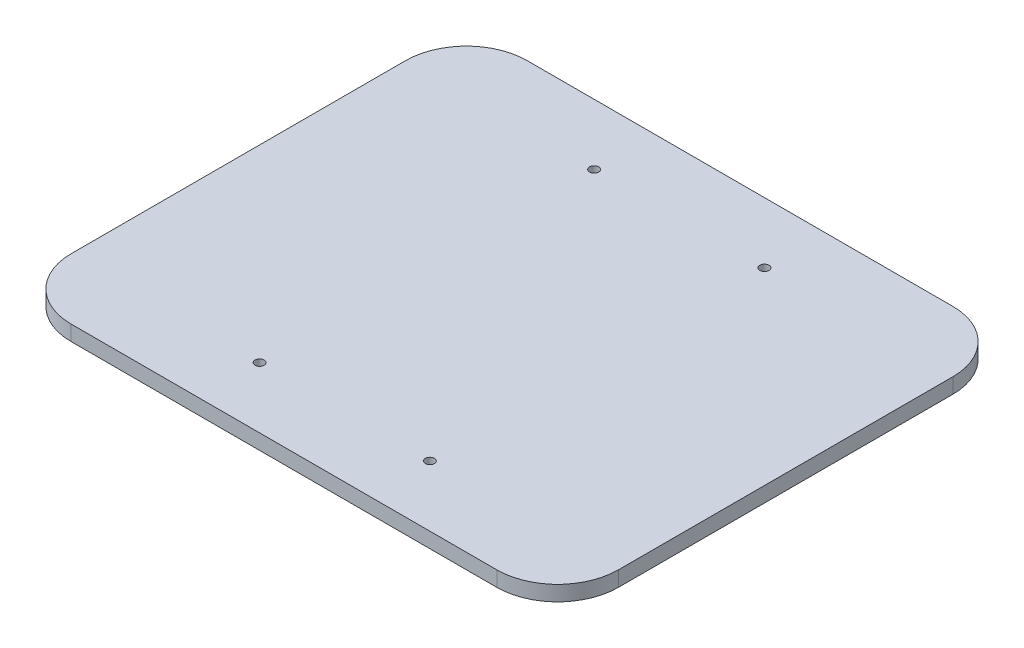
ISO-10303-21;
HEADER;
FILE_DESCRIPTION(('STEP AP214'),'2;1');
FILE_NAME('part.step','',(''),(''),'','','');
FILE_SCHEMA(('AUTOMOTIVE_DESIGN { 1 0 10303 214 1 1 1 1 }'));
ENDSEC;
DATA;
#1=APPLICATION_CONTEXT('core data for automotive mechanical design processes');
#2=APPLICATION_PROTOCOL_DEFINITION('international standard','automotive_design',2000,#1);
#3=PRODUCT_CONTEXT('',#1,'mechanical');
#4=PRODUCT('Part','Part','',(#3));
#5=PRODUCT_RELATED_PRODUCT_CATEGORY('part','',(#4));
#6=PRODUCT_DEFINITION_FORMATION('','',#4);
#7=PRODUCT_DEFINITION_CONTEXT('part definition',#1,'design');
#8=PRODUCT_DEFINITION('design','',#6,#7);
#9=PRODUCT_DEFINITION_SHAPE('','',#8);
#10=(LENGTH_UNIT() NAMED_UNIT(*) SI_UNIT(.MILLI.,.METRE.));
#11=(NAMED_UNIT(*) PLANE_ANGLE_UNIT() SI_UNIT($,.RADIAN.));
#12=(NAMED_UNIT(*) SI_UNIT($,.STERADIAN.) SOLID_ANGLE_UNIT());
#13=UNCERTAINTY_MEASURE_WITH_UNIT(LENGTH_MEASURE(1.E-05),#10,'distance_accuracy_value','');
#14=(GEOMETRIC_REPRESENTATION_CONTEXT(3) GLOBAL_UNCERTAINTY_ASSIGNED_CONTEXT((#13)) GLOBAL_UNIT_ASSIGNED_CONTEXT((#10,
#11,#12)) REPRESENTATION_CONTEXT('',''));
#15=CARTESIAN_POINT('',(0.,0.,0.));
#16=DIRECTION('',(0.,0.,1.));
#17=DIRECTION('',(1.,0.,0.));
#18=AXIS2_PLACEMENT_3D('',#15,#16,#17);
#19=CARTESIAN_POINT('',(99.18397760156,5.,-163.114483400198));
#20=DIRECTION('',(0.,-1.,0.));
#21=DIRECTION('',(0.,0.,-1.));
#22=AXIS2_PLACEMENT_3D('',#19,#20,#21);
#23=CYLINDRICAL_SURFACE('',#22,20.);
#24=CARTESIAN_POINT('',(99.18397760156,0.,-163.114483400198));
#25=DIRECTION('',(0.,1.,0.));
#26=DIRECTION('',(0.,0.,-1.));
#27=AXIS2_PLACEMENT_3D('',#24,#25,#26);
#28=CIRCLE('',#27,20.);
#29=CARTESIAN_POINT('',(119.18397760156,0.,-163.114483400198));
#30=VERTEX_POINT('',#29);
#31=CARTESIAN_POINT('',(99.18397760156,0.,-183.114483400198));
#32=VERTEX_POINT('',#31);
#33=EDGE_CURVE('E131',#30,#32,#28,.T.);
#34=ORIENTED_EDGE('',*,*,#33,.T.);
#35=DIRECTION('',(0.,-1.,0.));
#36=VECTOR('',#35,1.);
#37=CARTESIAN_POINT('',(99.18397760156,5.,-183.114483400198));
#38=LINE('',#37,#36);
#39=CARTESIAN_POINT('',(99.18397760156,5.,-183.114483400198));
#40=VERTEX_POINT('',#39);
#41=EDGE_CURVE('E11',#40,#32,#38,.T.);
#42=ORIENTED_EDGE('',*,*,#41,.F.);
#43=CARTESIAN_POINT('',(99.18397760156,5.,-163.114483400198));
#44=DIRECTION('',(0.,1.,0.));
#45=DIRECTION('',(0.,0.,-1.));
#46=AXIS2_PLACEMENT_3D('',#43,#44,#45);
#47=CIRCLE('',#46,20.);
#48=CARTESIAN_POINT('',(119.18397760156,5.,-163.114483400198));
#49=VERTEX_POINT('',#48);
#50=EDGE_CURVE('E146',#49,#40,#47,.T.);
#51=ORIENTED_EDGE('',*,*,#50,.F.);
#52=DIRECTION('',(0.,-1.,0.));
#53=VECTOR('',#52,1.);
#54=CARTESIAN_POINT('',(119.18397760156,5.,-163.114483400198));
#55=LINE('',#54,#53);
#56=EDGE_CURVE('E127',#49,#30,#55,.T.);
#57=ORIENTED_EDGE('',*,*,#56,.T.);
#58=EDGE_LOOP('',(#34,#42,#51,#57));
#59=FACE_BOUND('',#58,.T.);
#60=ADVANCED_FACE('F33',(#59),#23,.T.);
#61=CARTESIAN_POINT('',(-40.81602239844,5.,-183.114483400198));
#62=DIRECTION('',(0.,0.,1.));
#63=DIRECTION('',(1.,0.,0.));
#64=AXIS2_PLACEMENT_3D('',#61,#62,#63);
#65=PLANE('',#64);
#66=DIRECTION('',(-1.,0.,0.));
#67=VECTOR('',#66,1.);
#68=CARTESIAN_POINT('',(-40.81602239844,0.,-183.114483400198));
#69=LINE('',#68,#67);
#70=CARTESIAN_POINT('',(-40.81602239844,0.,-183.114483400198));
#71=VERTEX_POINT('',#70);
#72=EDGE_CURVE('E134',#32,#71,#69,.T.);
#73=ORIENTED_EDGE('',*,*,#72,.T.);
#74=DIRECTION('',(0.,-1.,0.));
#75=VECTOR('',#74,1.);
#76=CARTESIAN_POINT('',(-40.81602239844,5.,-183.114483400198));
#77=LINE('',#76,#75);
#78=CARTESIAN_POINT('',(-40.81602239844,5.,-183.114483400198));
#79=VERTEX_POINT('',#78);
#80=EDGE_CURVE('E42',#79,#71,#77,.T.);
#81=ORIENTED_EDGE('',*,*,#80,.F.);
#82=DIRECTION('',(-1.,0.,0.));
#83=VECTOR('',#82,1.);
#84=CARTESIAN_POINT('',(-40.81602239844,5.,-183.114483400198));
#85=LINE('',#84,#83);
#86=EDGE_CURVE('E94',#40,#79,#85,.T.);
#87=ORIENTED_EDGE('',*,*,#86,.F.);
#88=ORIENTED_EDGE('',*,*,#41,.T.);
#89=EDGE_LOOP('',(#73,#81,#87,#88));
#90=FACE_BOUND('',#89,.T.);
#91=ADVANCED_FACE('F213',(#90),#65,.F.);
#92=CARTESIAN_POINT('',(-40.81602239844,5.,-163.114483400198));
#93=DIRECTION('',(0.,-1.,0.));
#94=DIRECTION('',(0.,0.,-1.));
#95=AXIS2_PLACEMENT_3D('',#92,#93,#94);
#96=CYLINDRICAL_SURFACE('',#95,20.);
#97=CARTESIAN_POINT('',(-40.81602239844,0.,-163.114483400198));
#98=DIRECTION('',(0.,1.,0.));
#99=DIRECTION('',(0.,0.,1.));
#100=AXIS2_PLACEMENT_3D('',#97,#98,#99);
#101=CIRCLE('',#100,20.);
#102=CARTESIAN_POINT('',(-60.81602239844,0.,-163.114483400198));
#103=VERTEX_POINT('',#102);
#104=EDGE_CURVE('E137',#71,#103,#101,.T.);
#105=ORIENTED_EDGE('',*,*,#104,.T.);
#106=DIRECTION('',(0.,-1.,0.));
#107=VECTOR('',#106,1.);
#108=CARTESIAN_POINT('',(-60.81602239844,5.,-163.114483400198));
#109=LINE('',#108,#107);
#110=CARTESIAN_POINT('',(-60.81602239844,5.,-163.114483400198));
#111=VERTEX_POINT('',#110);
#112=EDGE_CURVE('E153',#111,#103,#109,.T.);
#113=ORIENTED_EDGE('',*,*,#112,.F.);
#114=CARTESIAN_POINT('',(-40.81602239844,5.,-163.114483400198));
#115=DIRECTION('',(0.,1.,0.));
#116=DIRECTION('',(0.,0.,1.));
#117=AXIS2_PLACEMENT_3D('',#114,#115,#116);
#118=CIRCLE('',#117,20.);
#119=EDGE_CURVE('E181',#79,#111,#118,.T.);
#120=ORIENTED_EDGE('',*,*,#119,.F.);
#121=ORIENTED_EDGE('',*,*,#80,.T.);
#122=EDGE_LOOP('',(#105,#113,#120,#121));
#123=FACE_BOUND('',#122,.T.);
#124=ADVANCED_FACE('F217',(#123),#96,.T.);
#125=CARTESIAN_POINT('',(-60.81602239844,5.,-163.114483400198));
#126=DIRECTION('',(1.,0.,0.));
#127=DIRECTION('',(0.,0.,-1.));
#128=AXIS2_PLACEMENT_3D('',#125,#126,#127);
#129=PLANE('',#128);
#130=DIRECTION('',(0.,0.,1.));
#131=VECTOR('',#130,1.);
#132=CARTESIAN_POINT('',(-60.81602239844,0.,-163.114483400198));
#133=LINE('',#132,#131);
#134=CARTESIAN_POINT('',(-60.81602239844,0.,-53.1144834001978));
#135=VERTEX_POINT('',#134);
#136=EDGE_CURVE('E139',#103,#135,#133,.T.);
#137=ORIENTED_EDGE('',*,*,#136,.T.);
#138=DIRECTION('',(0.,-1.,0.));
#139=VECTOR('',#138,1.);
#140=CARTESIAN_POINT('',(-60.81602239844,5.,-53.1144834001978));
#141=LINE('',#140,#139);
#142=CARTESIAN_POINT('',(-60.81602239844,5.,-53.1144834001978));
#143=VERTEX_POINT('',#142);
#144=EDGE_CURVE('E150',#143,#135,#141,.T.);
#145=ORIENTED_EDGE('',*,*,#144,.F.);
#146=DIRECTION('',(0.,0.,1.));
#147=VECTOR('',#146,1.);
#148=CARTESIAN_POINT('',(-60.81602239844,5.,-163.114483400198));
#149=LINE('',#148,#147);
#150=EDGE_CURVE('E183',#111,#143,#149,.T.);
#151=ORIENTED_EDGE('',*,*,#150,.F.);
#152=ORIENTED_EDGE('',*,*,#112,.T.);
#153=EDGE_LOOP('',(#137,#145,#151,#152));
#154=FACE_BOUND('',#153,.T.);
#155=ADVANCED_FACE('F189',(#154),#129,.F.);
#156=CARTESIAN_POINT('',(-40.81602239844,5.,-53.1144834001977));
#157=DIRECTION('',(0.,-1.,0.));
#158=DIRECTION('',(0.,0.,-1.));
#159=AXIS2_PLACEMENT_3D('',#156,#157,#158);
#160=CYLINDRICAL_SURFACE('',#159,20.);
#161=CARTESIAN_POINT('',(-40.81602239844,0.,-53.1144834001977));
#162=DIRECTION('',(0.,1.,0.));
#163=DIRECTION('',(0.,0.,1.));
#164=AXIS2_PLACEMENT_3D('',#161,#162,#163);
#165=CIRCLE('',#164,20.);
#166=CARTESIAN_POINT('',(-40.81602239844,0.,-33.1144834001977));
#167=VERTEX_POINT('',#166);
#168=EDGE_CURVE('E141',#135,#167,#165,.T.);
#169=ORIENTED_EDGE('',*,*,#168,.T.);
#170=DIRECTION('',(0.,-1.,0.));
#171=VECTOR('',#170,1.);
#172=CARTESIAN_POINT('',(-40.81602239844,5.,-33.1144834001977));
#173=LINE('',#172,#171);
#174=CARTESIAN_POINT('',(-40.81602239844,5.,-33.1144834001977));
#175=VERTEX_POINT('',#174);
#176=EDGE_CURVE('E122',#175,#167,#173,.T.);
#177=ORIENTED_EDGE('',*,*,#176,.F.);
#178=CARTESIAN_POINT('',(-40.81602239844,5.,-53.1144834001977));
#179=DIRECTION('',(0.,1.,0.));
#180=DIRECTION('',(0.,0.,1.));
#181=AXIS2_PLACEMENT_3D('',#178,#179,#180);
#182=CIRCLE('',#181,20.);
#183=EDGE_CURVE('E113',#143,#175,#182,.T.);
#184=ORIENTED_EDGE('',*,*,#183,.F.);
#185=ORIENTED_EDGE('',*,*,#144,.T.);
#186=EDGE_LOOP('',(#169,#177,#184,#185));
#187=FACE_BOUND('',#186,.T.);
#188=ADVANCED_FACE('F193',(#187),#160,.T.);
#189=CARTESIAN_POINT('',(-40.8160223984398,5.,-33.1144834001977));
#190=DIRECTION('',(0.,0.,-1.));
#191=DIRECTION('',(-1.,0.,0.));
#192=AXIS2_PLACEMENT_3D('',#189,#190,#191);
#193=PLANE('',#192);
#194=DIRECTION('',(1.,0.,0.));
#195=VECTOR('',#194,1.);
#196=CARTESIAN_POINT('',(-40.8160223984398,0.,-33.1144834001977));
#197=LINE('',#196,#195);
#198=CARTESIAN_POINT('',(99.18397760156,0.,-33.1144834001977));
#199=VERTEX_POINT('',#198);
#200=EDGE_CURVE('E121',#167,#199,#197,.T.);
#201=ORIENTED_EDGE('',*,*,#200,.T.);
#202=DIRECTION('',(0.,-1.,0.));
#203=VECTOR('',#202,1.);
#204=CARTESIAN_POINT('',(99.18397760156,5.,-33.1144834001977));
#205=LINE('',#204,#203);
#206=CARTESIAN_POINT('',(99.18397760156,5.,-33.1144834001977));
#207=VERTEX_POINT('',#206);
#208=EDGE_CURVE('E118',#207,#199,#205,.T.);
#209=ORIENTED_EDGE('',*,*,#208,.F.);
#210=DIRECTION('',(1.,0.,0.));
#211=VECTOR('',#210,1.);
#212=CARTESIAN_POINT('',(-40.8160223984398,5.,-33.1144834001977));
#213=LINE('',#212,#211);
#214=EDGE_CURVE('E107',#175,#207,#213,.T.);
#215=ORIENTED_EDGE('',*,*,#214,.F.);
#216=ORIENTED_EDGE('',*,*,#176,.T.);
#217=EDGE_LOOP('',(#201,#209,#215,#216));
#218=FACE_BOUND('',#217,.T.);
#219=ADVANCED_FACE('F119',(#218),#193,.F.);
#220=CARTESIAN_POINT('',(99.18397760156,5.,-53.1144834001977));
#221=DIRECTION('',(0.,-1.,0.));
#222=DIRECTION('',(0.,0.,-1.));
#223=AXIS2_PLACEMENT_3D('',#220,#221,#222);
#224=CYLINDRICAL_SURFACE('',#223,20.);
#225=CARTESIAN_POINT('',(99.18397760156,0.,-53.1144834001977));
#226=DIRECTION('',(0.,1.,0.));
#227=DIRECTION('',(0.,0.,1.));
#228=AXIS2_PLACEMENT_3D('',#225,#226,#227);
#229=CIRCLE('',#228,20.);
#230=CARTESIAN_POINT('',(119.18397760156,0.,-53.1144834001977));
#231=VERTEX_POINT('',#230);
#232=EDGE_CURVE('E80',#199,#231,#229,.T.);
#233=ORIENTED_EDGE('',*,*,#232,.T.);
#234=DIRECTION('',(0.,-1.,0.));
#235=VECTOR('',#234,1.);
#236=CARTESIAN_POINT('',(119.18397760156,5.,-53.1144834001977));
#237=LINE('',#236,#235);
#238=CARTESIAN_POINT('',(119.18397760156,5.,-53.1144834001977));
#239=VERTEX_POINT('',#238);
#240=EDGE_CURVE('E123',#239,#231,#237,.T.);
#241=ORIENTED_EDGE('',*,*,#240,.F.);
#242=CARTESIAN_POINT('',(99.18397760156,5.,-53.1144834001977));
#243=DIRECTION('',(0.,1.,0.));
#244=DIRECTION('',(0.,0.,1.));
#245=AXIS2_PLACEMENT_3D('',#242,#243,#244);
#246=CIRCLE('',#245,20.);
#247=EDGE_CURVE('E111',#207,#239,#246,.T.);
#248=ORIENTED_EDGE('',*,*,#247,.F.);
#249=ORIENTED_EDGE('',*,*,#208,.T.);
#250=EDGE_LOOP('',(#233,#241,#248,#249));
#251=FACE_BOUND('',#250,.T.);
#252=ADVANCED_FACE('F125',(#251),#224,.T.);
#253=CARTESIAN_POINT('',(119.18397760156,5.,-163.114483400198));
#254=DIRECTION('',(-1.,0.,0.));
#255=DIRECTION('',(0.,0.,1.));
#256=AXIS2_PLACEMENT_3D('',#253,#254,#255);
#257=PLANE('',#256);
#258=DIRECTION('',(0.,0.,-1.));
#259=VECTOR('',#258,1.);
#260=CARTESIAN_POINT('',(119.18397760156,0.,-163.114483400198));
#261=LINE('',#260,#259);
#262=EDGE_CURVE('E86',#231,#30,#261,.T.);
#263=ORIENTED_EDGE('',*,*,#262,.T.);
#264=ORIENTED_EDGE('',*,*,#56,.F.);
#265=DIRECTION('',(0.,0.,-1.));
#266=VECTOR('',#265,1.);
#267=CARTESIAN_POINT('',(119.18397760156,5.,-163.114483400198));
#268=LINE('',#267,#266);
#269=EDGE_CURVE('E51',#239,#49,#268,.T.);
#270=ORIENTED_EDGE('',*,*,#269,.F.);
#271=ORIENTED_EDGE('',*,*,#240,.T.);
#272=EDGE_LOOP('',(#263,#264,#270,#271));
#273=FACE_BOUND('',#272,.T.);
#274=ADVANCED_FACE('F201',(#273),#257,.F.);
#275=CARTESIAN_POINT('',(99.18397760156,5.,-163.114483400198));
#276=DIRECTION('',(0.,-1.,0.));
#277=DIRECTION('',(0.,0.,-1.));
#278=AXIS2_PLACEMENT_3D('',#275,#276,#277);
#279=PLANE('',#278);
#280=CARTESIAN_POINT('',(57.18397760156,5.,-163.114483400198));
#281=DIRECTION('',(0.,1.,0.));
#282=DIRECTION('',(0.,0.,1.));
#283=AXIS2_PLACEMENT_3D('',#280,#281,#282);
#284=CIRCLE('',#283,1.5);
#285=CARTESIAN_POINT('',(57.18397760156,5.,-161.614483400198));
#286=VERTEX_POINT('',#285);
#287=EDGE_CURVE('E164',#286,#286,#284,.T.);
#288=ORIENTED_EDGE('',*,*,#287,.F.);
#289=EDGE_LOOP('',(#288));
#290=FACE_BOUND('',#289,.T.);
#291=CARTESIAN_POINT('',(57.18397760156,5.,-53.1144834001977));
#292=DIRECTION('',(0.,1.,0.));
#293=DIRECTION('',(0.,0.,1.));
#294=AXIS2_PLACEMENT_3D('',#291,#292,#293);
#295=CIRCLE('',#294,1.5);
#296=CARTESIAN_POINT('',(57.18397760156,5.,-51.6144834001977));
#297=VERTEX_POINT('',#296);
#298=EDGE_CURVE('E300',#297,#297,#295,.T.);
#299=ORIENTED_EDGE('',*,*,#298,.F.);
#300=EDGE_LOOP('',(#299));
#301=FACE_BOUND('',#300,.T.);
#302=CARTESIAN_POINT('',(1.18397760156001,5.,-53.1144834001977));
#303=DIRECTION('',(0.,1.,0.));
#304=DIRECTION('',(0.,0.,1.));
#305=AXIS2_PLACEMENT_3D('',#302,#303,#304);
#306=CIRCLE('',#305,1.5);
#307=CARTESIAN_POINT('',(1.18397760156001,5.,-51.6144834001977));
#308=VERTEX_POINT('',#307);
#309=EDGE_CURVE('E177',#308,#308,#306,.T.);
#310=ORIENTED_EDGE('',*,*,#309,.F.);
#311=EDGE_LOOP('',(#310));
#312=FACE_BOUND('',#311,.T.);
#313=CARTESIAN_POINT('',(1.18397760156001,5.,-163.114483400198));
#314=DIRECTION('',(0.,1.,0.));
#315=DIRECTION('',(0.,0.,1.));
#316=AXIS2_PLACEMENT_3D('',#313,#314,#315);
#317=CIRCLE('',#316,1.5);
#318=CARTESIAN_POINT('',(1.18397760156001,5.,-161.614483400198));
#319=VERTEX_POINT('',#318);
#320=EDGE_CURVE('E160',#319,#319,#317,.T.);
#321=ORIENTED_EDGE('',*,*,#320,.F.);
#322=EDGE_LOOP('',(#321));
#323=FACE_BOUND('',#322,.T.);
#324=ORIENTED_EDGE('',*,*,#50,.T.);
#325=ORIENTED_EDGE('',*,*,#86,.T.);
#326=ORIENTED_EDGE('',*,*,#119,.T.);
#327=ORIENTED_EDGE('',*,*,#150,.T.);
#328=ORIENTED_EDGE('',*,*,#183,.T.);
#329=ORIENTED_EDGE('',*,*,#214,.T.);
#330=ORIENTED_EDGE('',*,*,#247,.T.);
#331=ORIENTED_EDGE('',*,*,#269,.T.);
#332=EDGE_LOOP('',(#324,#325,#326,#327,#328,#329,#330,#331));
#333=FACE_BOUND('',#332,.T.);
#334=ADVANCED_FACE('F109',(#290,#301,#312,#323,#333),#279,.F.);
#335=CARTESIAN_POINT('',(99.18397760156,0.,-163.114483400198));
#336=DIRECTION('',(0.,-1.,0.));
#337=DIRECTION('',(0.,0.,-1.));
#338=AXIS2_PLACEMENT_3D('',#335,#336,#337);
#339=PLANE('',#338);
#340=CARTESIAN_POINT('',(57.18397760156,0.,-163.114483400198));
#341=DIRECTION('',(0.,-1.,0.));
#342=DIRECTION('',(0.,0.,-1.));
#343=AXIS2_PLACEMENT_3D('',#340,#341,#342);
#344=CIRCLE('',#343,1.5);
#345=CARTESIAN_POINT('',(57.18397760156,0.,-164.614483400198));
#346=VERTEX_POINT('',#345);
#347=EDGE_CURVE('E36',#346,#346,#344,.T.);
#348=ORIENTED_EDGE('',*,*,#347,.F.);
#349=EDGE_LOOP('',(#348));
#350=FACE_BOUND('',#349,.T.);
#351=CARTESIAN_POINT('',(57.18397760156,0.,-53.1144834001977));
#352=DIRECTION('',(0.,-1.,0.));
#353=DIRECTION('',(0.,0.,-1.));
#354=AXIS2_PLACEMENT_3D('',#351,#352,#353);
#355=CIRCLE('',#354,1.5);
#356=CARTESIAN_POINT('',(57.18397760156,0.,-54.6144834001977));
#357=VERTEX_POINT('',#356);
#358=EDGE_CURVE('E163',#357,#357,#355,.T.);
#359=ORIENTED_EDGE('',*,*,#358,.F.);
#360=EDGE_LOOP('',(#359));
#361=FACE_BOUND('',#360,.T.);
#362=CARTESIAN_POINT('',(1.18397760156001,0.,-53.1144834001977));
#363=DIRECTION('',(0.,-1.,0.));
#364=DIRECTION('',(0.,0.,-1.));
#365=AXIS2_PLACEMENT_3D('',#362,#363,#364);
#366=CIRCLE('',#365,1.5);
#367=CARTESIAN_POINT('',(1.18397760156001,0.,-54.6144834001977));
#368=VERTEX_POINT('',#367);
#369=EDGE_CURVE('E161',#368,#368,#366,.T.);
#370=ORIENTED_EDGE('',*,*,#369,.F.);
#371=EDGE_LOOP('',(#370));
#372=FACE_BOUND('',#371,.T.);
#373=CARTESIAN_POINT('',(1.18397760156001,0.,-163.114483400198));
#374=DIRECTION('',(0.,-1.,0.));
#375=DIRECTION('',(0.,0.,-1.));
#376=AXIS2_PLACEMENT_3D('',#373,#374,#375);
#377=CIRCLE('',#376,1.5);
#378=CARTESIAN_POINT('',(1.18397760156001,0.,-164.614483400198));
#379=VERTEX_POINT('',#378);
#380=EDGE_CURVE('E135',#379,#379,#377,.T.);
#381=ORIENTED_EDGE('',*,*,#380,.F.);
#382=EDGE_LOOP('',(#381));
#383=FACE_BOUND('',#382,.T.);
#384=ORIENTED_EDGE('',*,*,#33,.F.);
#385=ORIENTED_EDGE('',*,*,#262,.F.);
#386=ORIENTED_EDGE('',*,*,#232,.F.);
#387=ORIENTED_EDGE('',*,*,#200,.F.);
#388=ORIENTED_EDGE('',*,*,#168,.F.);
#389=ORIENTED_EDGE('',*,*,#136,.F.);
#390=ORIENTED_EDGE('',*,*,#104,.F.);
#391=ORIENTED_EDGE('',*,*,#72,.F.);
#392=EDGE_LOOP('',(#384,#385,#386,#387,#388,#389,#390,#391));
#393=FACE_BOUND('',#392,.T.);
#394=ADVANCED_FACE('F196',(#350,#361,#372,#383,#393),#339,.T.);
#395=CARTESIAN_POINT('',(1.18397760156001,-5.,-163.114483400198));
#396=DIRECTION('',(0.,1.,0.));
#397=DIRECTION('',(0.,0.,1.));
#398=AXIS2_PLACEMENT_3D('',#395,#396,#397);
#399=CYLINDRICAL_SURFACE('',#398,1.5);
#400=ORIENTED_EDGE('',*,*,#380,.T.);
#401=EDGE_LOOP('',(#400));
#402=FACE_BOUND('',#401,.T.);
#403=ORIENTED_EDGE('',*,*,#320,.T.);
#404=EDGE_LOOP('',(#403));
#405=FACE_BOUND('',#404,.T.);
#406=ADVANCED_FACE('F256',(#402,#405),#399,.F.);
#407=CARTESIAN_POINT('',(1.18397760156001,-5.,-53.1144834001977));
#408=DIRECTION('',(0.,1.,0.));
#409=DIRECTION('',(0.,0.,1.));
#410=AXIS2_PLACEMENT_3D('',#407,#408,#409);
#411=CYLINDRICAL_SURFACE('',#410,1.5);
#412=ORIENTED_EDGE('',*,*,#369,.T.);
#413=EDGE_LOOP('',(#412));
#414=FACE_BOUND('',#413,.T.);
#415=ORIENTED_EDGE('',*,*,#309,.T.);
#416=EDGE_LOOP('',(#415));
#417=FACE_BOUND('',#416,.T.);
#418=ADVANCED_FACE('F265',(#414,#417),#411,.F.);
#419=CARTESIAN_POINT('',(57.18397760156,-5.,-53.1144834001977));
#420=DIRECTION('',(0.,1.,0.));
#421=DIRECTION('',(0.,0.,1.));
#422=AXIS2_PLACEMENT_3D('',#419,#420,#421);
#423=CYLINDRICAL_SURFACE('',#422,1.5);
#424=ORIENTED_EDGE('',*,*,#358,.T.);
#425=EDGE_LOOP('',(#424));
#426=FACE_BOUND('',#425,.T.);
#427=ORIENTED_EDGE('',*,*,#298,.T.);
#428=EDGE_LOOP('',(#427));
#429=FACE_BOUND('',#428,.T.);
#430=ADVANCED_FACE('F275',(#426,#429),#423,.F.);
#431=CARTESIAN_POINT('',(57.18397760156,-5.,-163.114483400198));
#432=DIRECTION('',(0.,1.,0.));
#433=DIRECTION('',(0.,0.,1.));
#434=AXIS2_PLACEMENT_3D('',#431,#432,#433);
#435=CYLINDRICAL_SURFACE('',#434,1.5);
#436=ORIENTED_EDGE('',*,*,#347,.T.);
#437=EDGE_LOOP('',(#436));
#438=FACE_BOUND('',#437,.T.);
#439=ORIENTED_EDGE('',*,*,#287,.T.);
#440=EDGE_LOOP('',(#439));
#441=FACE_BOUND('',#440,.T.);
#442=ADVANCED_FACE('F285',(#438,#441),#435,.F.);
#443=CLOSED_SHELL('',(#60,#91,#124,#155,#188,#219,#252,#274,#334,#394,#406,#418,#430,#442));
#444=MANIFOLD_SOLID_BREP('B2',#443);
#445=ADVANCED_BREP_SHAPE_REPRESENTATION('',(#18,#444),#14);
#446=SHAPE_DEFINITION_REPRESENTATION(#9,#445);
ENDSEC;
END-ISO-10303-21;
